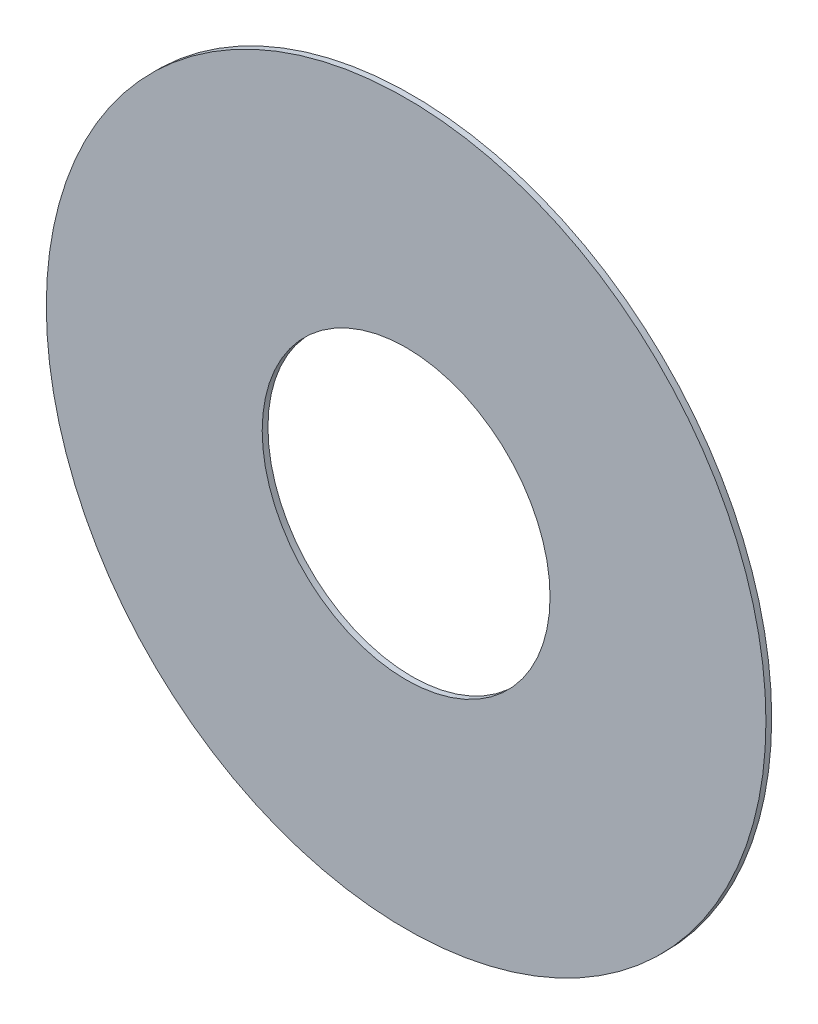
ISO-10303-21;
HEADER;
FILE_DESCRIPTION(('STEP AP214'),'2;1');
FILE_NAME('part.step','',(''),(''),'','','');
FILE_SCHEMA(('AUTOMOTIVE_DESIGN { 1 0 10303 214 1 1 1 1 }'));
ENDSEC;
DATA;
#1=APPLICATION_CONTEXT('core data for automotive mechanical design processes');
#2=APPLICATION_PROTOCOL_DEFINITION('international standard','automotive_design',2000,#1);
#3=PRODUCT_CONTEXT('',#1,'mechanical');
#4=PRODUCT('Part','Part','',(#3));
#5=PRODUCT_RELATED_PRODUCT_CATEGORY('part','',(#4));
#6=PRODUCT_DEFINITION_FORMATION('','',#4);
#7=PRODUCT_DEFINITION_CONTEXT('part definition',#1,'design');
#8=PRODUCT_DEFINITION('design','',#6,#7);
#9=PRODUCT_DEFINITION_SHAPE('','',#8);
#10=(LENGTH_UNIT() NAMED_UNIT(*) SI_UNIT(.MILLI.,.METRE.));
#11=(NAMED_UNIT(*) PLANE_ANGLE_UNIT() SI_UNIT($,.RADIAN.));
#12=(NAMED_UNIT(*) SI_UNIT($,.STERADIAN.) SOLID_ANGLE_UNIT());
#13=UNCERTAINTY_MEASURE_WITH_UNIT(LENGTH_MEASURE(1.E-05),#10,'distance_accuracy_value','');
#14=(GEOMETRIC_REPRESENTATION_CONTEXT(3) GLOBAL_UNCERTAINTY_ASSIGNED_CONTEXT((#13)) GLOBAL_UNIT_ASSIGNED_CONTEXT((#10,
#11,#12)) REPRESENTATION_CONTEXT('',''));
#15=CARTESIAN_POINT('',(0.,0.,0.));
#16=DIRECTION('',(0.,0.,1.));
#17=DIRECTION('',(1.,0.,0.));
#18=AXIS2_PLACEMENT_3D('',#15,#16,#17);
#19=CARTESIAN_POINT('',(0.,0.,0.389935));
#20=DIRECTION('',(0.,0.,1.));
#21=DIRECTION('',(1.,0.,0.));
#22=AXIS2_PLACEMENT_3D('',#19,#20,#21);
#23=PLANE('',#22);
#24=CARTESIAN_POINT('',(0.,0.,0.389935));
#25=DIRECTION('',(0.,0.,1.));
#26=DIRECTION('',(1.,0.,0.));
#27=AXIS2_PLACEMENT_3D('',#24,#25,#26);
#28=CIRCLE('',#27,36.241875);
#29=CARTESIAN_POINT('',(36.241875,0.,0.389935));
#30=VERTEX_POINT('',#29);
#31=EDGE_CURVE('E10',#30,#30,#28,.T.);
#32=ORIENTED_EDGE('',*,*,#31,.T.);
#33=EDGE_LOOP('',(#32));
#34=FACE_BOUND('',#33,.T.);
#35=CARTESIAN_POINT('',(0.,0.,0.389935));
#36=DIRECTION('',(0.,0.,1.));
#37=DIRECTION('',(1.,0.,0.));
#38=AXIS2_PLACEMENT_3D('',#35,#36,#37);
#39=CIRCLE('',#38,14.49675);
#40=CARTESIAN_POINT('',(14.49675,0.,0.389935));
#41=VERTEX_POINT('',#40);
#42=EDGE_CURVE('E43',#41,#41,#39,.T.);
#43=ORIENTED_EDGE('',*,*,#42,.F.);
#44=EDGE_LOOP('',(#43));
#45=FACE_BOUND('',#44,.T.);
#46=ADVANCED_FACE('F32',(#34,#45),#23,.T.);
#47=CARTESIAN_POINT('',(0.,0.,-0.189935));
#48=DIRECTION('',(0.,0.,1.));
#49=DIRECTION('',(1.,0.,0.));
#50=AXIS2_PLACEMENT_3D('',#47,#48,#49);
#51=PLANE('',#50);
#52=CARTESIAN_POINT('',(0.,0.,-0.189935));
#53=DIRECTION('',(0.,0.,1.));
#54=DIRECTION('',(1.,0.,0.));
#55=AXIS2_PLACEMENT_3D('',#52,#53,#54);
#56=CIRCLE('',#55,36.241875);
#57=CARTESIAN_POINT('',(36.241875,0.,-0.189935));
#58=VERTEX_POINT('',#57);
#59=EDGE_CURVE('E36',#58,#58,#56,.T.);
#60=ORIENTED_EDGE('',*,*,#59,.F.);
#61=EDGE_LOOP('',(#60));
#62=FACE_BOUND('',#61,.T.);
#63=CARTESIAN_POINT('',(0.,0.,-0.189935));
#64=DIRECTION('',(0.,0.,1.));
#65=DIRECTION('',(1.,0.,0.));
#66=AXIS2_PLACEMENT_3D('',#63,#64,#65);
#67=CIRCLE('',#66,14.49675);
#68=CARTESIAN_POINT('',(14.49675,0.,-0.189935));
#69=VERTEX_POINT('',#68);
#70=EDGE_CURVE('E45',#69,#69,#67,.T.);
#71=ORIENTED_EDGE('',*,*,#70,.T.);
#72=EDGE_LOOP('',(#71));
#73=FACE_BOUND('',#72,.T.);
#74=ADVANCED_FACE('F55',(#62,#73),#51,.F.);
#75=CARTESIAN_POINT('',(0.,0.,0.389935));
#76=DIRECTION('',(0.,0.,-1.));
#77=DIRECTION('',(-1.,0.,0.));
#78=AXIS2_PLACEMENT_3D('',#75,#76,#77);
#79=CYLINDRICAL_SURFACE('',#78,36.241875);
#80=ORIENTED_EDGE('',*,*,#31,.F.);
#81=EDGE_LOOP('',(#80));
#82=FACE_BOUND('',#81,.T.);
#83=ORIENTED_EDGE('',*,*,#59,.T.);
#84=EDGE_LOOP('',(#83));
#85=FACE_BOUND('',#84,.T.);
#86=ADVANCED_FACE('F34',(#82,#85),#79,.T.);
#87=CARTESIAN_POINT('',(0.,0.,0.389935));
#88=DIRECTION('',(0.,0.,-1.));
#89=DIRECTION('',(-1.,0.,0.));
#90=AXIS2_PLACEMENT_3D('',#87,#88,#89);
#91=CYLINDRICAL_SURFACE('',#90,14.49675);
#92=ORIENTED_EDGE('',*,*,#42,.T.);
#93=EDGE_LOOP('',(#92));
#94=FACE_BOUND('',#93,.T.);
#95=ORIENTED_EDGE('',*,*,#70,.F.);
#96=EDGE_LOOP('',(#95));
#97=FACE_BOUND('',#96,.T.);
#98=ADVANCED_FACE('F51',(#94,#97),#91,.F.);
#99=CLOSED_SHELL('',(#46,#74,#86,#98));
#100=MANIFOLD_SOLID_BREP('B2',#99);
#101=ADVANCED_BREP_SHAPE_REPRESENTATION('',(#18,#100),#14);
#102=SHAPE_DEFINITION_REPRESENTATION(#9,#101);
ENDSEC;
END-ISO-10303-21;
